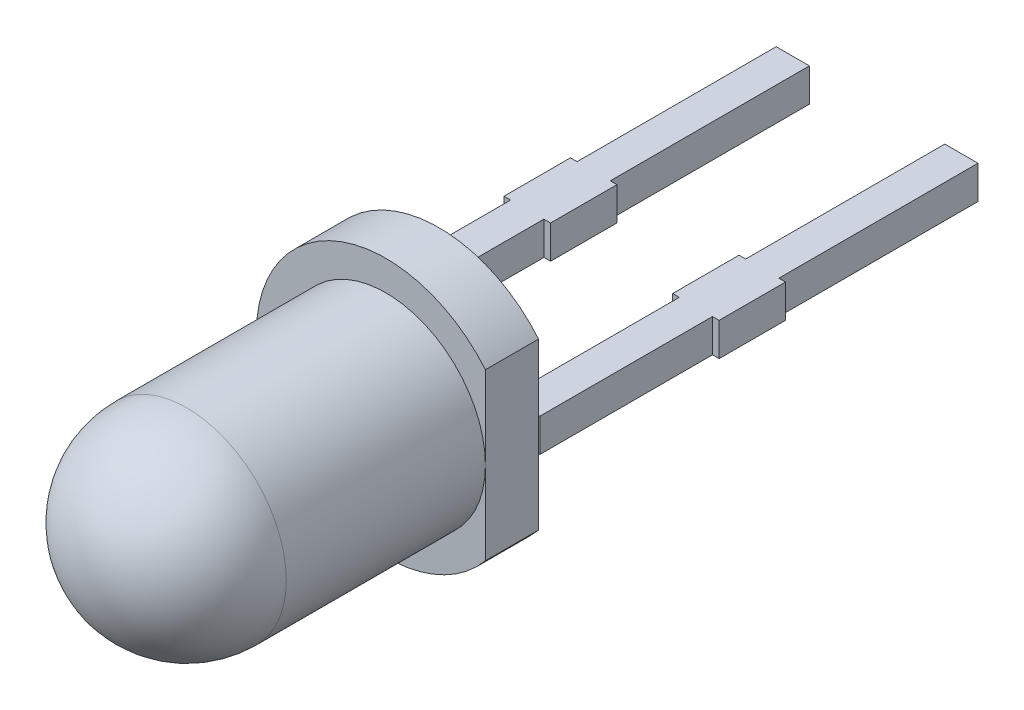
ISO-10303-21;
HEADER;
FILE_DESCRIPTION(('STEP AP214'),'2;1');
FILE_NAME('part.step','',(''),(''),'','','');
FILE_SCHEMA(('AUTOMOTIVE_DESIGN { 1 0 10303 214 1 1 1 1 }'));
ENDSEC;
DATA;
#1=APPLICATION_CONTEXT('core data for automotive mechanical design processes');
#2=APPLICATION_PROTOCOL_DEFINITION('international standard','automotive_design',2000,#1);
#3=PRODUCT_CONTEXT('',#1,'mechanical');
#4=PRODUCT('Part','Part','',(#3));
#5=PRODUCT_RELATED_PRODUCT_CATEGORY('part','',(#4));
#6=PRODUCT_DEFINITION_FORMATION('','',#4);
#7=PRODUCT_DEFINITION_CONTEXT('part definition',#1,'design');
#8=PRODUCT_DEFINITION('design','',#6,#7);
#9=PRODUCT_DEFINITION_SHAPE('','',#8);
#10=(LENGTH_UNIT() NAMED_UNIT(*) SI_UNIT(.MILLI.,.METRE.));
#11=(NAMED_UNIT(*) PLANE_ANGLE_UNIT() SI_UNIT($,.RADIAN.));
#12=(NAMED_UNIT(*) SI_UNIT($,.STERADIAN.) SOLID_ANGLE_UNIT());
#13=UNCERTAINTY_MEASURE_WITH_UNIT(LENGTH_MEASURE(1.E-05),#10,'distance_accuracy_value','');
#14=(GEOMETRIC_REPRESENTATION_CONTEXT(3) GLOBAL_UNCERTAINTY_ASSIGNED_CONTEXT((#13)) GLOBAL_UNIT_ASSIGNED_CONTEXT((#10,
#11,#12)) REPRESENTATION_CONTEXT('',''));
#15=CARTESIAN_POINT('',(0.,0.,0.));
#16=DIRECTION('',(0.,0.,1.));
#17=DIRECTION('',(1.,0.,0.));
#18=AXIS2_PLACEMENT_3D('',#15,#16,#17);
#19=CARTESIAN_POINT('',(-1.52,-0.25,3.6));
#20=DIRECTION('',(1.,0.,0.));
#21=DIRECTION('',(0.,0.,-1.));
#22=AXIS2_PLACEMENT_3D('',#19,#20,#21);
#23=PLANE('',#22);
#24=DIRECTION('',(0.,0.,-1.));
#25=VECTOR('',#24,1.);
#26=CARTESIAN_POINT('',(-1.52,0.25,3.6));
#27=LINE('',#26,#25);
#28=CARTESIAN_POINT('',(-1.52,0.25,3.6));
#29=VERTEX_POINT('',#28);
#30=CARTESIAN_POINT('',(-1.52,0.25,0.999999999999999));
#31=VERTEX_POINT('',#30);
#32=EDGE_CURVE('E162',#29,#31,#27,.T.);
#33=ORIENTED_EDGE('',*,*,#32,.T.);
#34=DIRECTION('',(0.,1.,0.));
#35=VECTOR('',#34,1.);
#36=CARTESIAN_POINT('',(-1.52,-0.25,0.999999999999999));
#37=LINE('',#36,#35);
#38=CARTESIAN_POINT('',(-1.52,-0.25,0.999999999999999));
#39=VERTEX_POINT('',#38);
#40=EDGE_CURVE('E41',#39,#31,#37,.T.);
#41=ORIENTED_EDGE('',*,*,#40,.F.);
#42=DIRECTION('',(0.,0.,-1.));
#43=VECTOR('',#42,1.);
#44=CARTESIAN_POINT('',(-1.52,-0.25,3.6));
#45=LINE('',#44,#43);
#46=CARTESIAN_POINT('',(-1.52,-0.25,3.6));
#47=VERTEX_POINT('',#46);
#48=EDGE_CURVE('E108',#47,#39,#45,.T.);
#49=ORIENTED_EDGE('',*,*,#48,.F.);
#50=DIRECTION('',(0.,1.,0.));
#51=VECTOR('',#50,1.);
#52=CARTESIAN_POINT('',(-1.52,-0.25,3.6));
#53=LINE('',#52,#51);
#54=EDGE_CURVE('E11',#47,#29,#53,.T.);
#55=ORIENTED_EDGE('',*,*,#54,.T.);
#56=EDGE_LOOP('',(#33,#41,#49,#55));
#57=FACE_BOUND('',#56,.T.);
#58=ADVANCED_FACE('F34',(#57),#23,.F.);
#59=CARTESIAN_POINT('',(-1.52,-0.25,0.999999999999999));
#60=DIRECTION('',(0.,0.,-1.));
#61=DIRECTION('',(-1.,0.,0.));
#62=AXIS2_PLACEMENT_3D('',#59,#60,#61);
#63=PLANE('',#62);
#64=DIRECTION('',(-1.,0.,0.));
#65=VECTOR('',#64,1.);
#66=CARTESIAN_POINT('',(-1.52,0.25,0.999999999999999));
#67=LINE('',#66,#65);
#68=CARTESIAN_POINT('',(-1.62,0.25,0.999999999999999));
#69=VERTEX_POINT('',#68);
#70=EDGE_CURVE('E165',#31,#69,#67,.T.);
#71=ORIENTED_EDGE('',*,*,#70,.T.);
#72=DIRECTION('',(0.,1.,0.));
#73=VECTOR('',#72,1.);
#74=CARTESIAN_POINT('',(-1.62,-0.25,0.999999999999999));
#75=LINE('',#74,#73);
#76=CARTESIAN_POINT('',(-1.62,-0.25,0.999999999999999));
#77=VERTEX_POINT('',#76);
#78=EDGE_CURVE('E204',#77,#69,#75,.T.);
#79=ORIENTED_EDGE('',*,*,#78,.F.);
#80=DIRECTION('',(-1.,0.,0.));
#81=VECTOR('',#80,1.);
#82=CARTESIAN_POINT('',(-1.52,-0.25,0.999999999999999));
#83=LINE('',#82,#81);
#84=EDGE_CURVE('E212',#39,#77,#83,.T.);
#85=ORIENTED_EDGE('',*,*,#84,.F.);
#86=ORIENTED_EDGE('',*,*,#40,.T.);
#87=EDGE_LOOP('',(#71,#79,#85,#86));
#88=FACE_BOUND('',#87,.T.);
#89=ADVANCED_FACE('F210',(#88),#63,.F.);
#90=CARTESIAN_POINT('',(-1.62,-0.25,0.999999999999999));
#91=DIRECTION('',(1.,0.,0.));
#92=DIRECTION('',(0.,0.,-1.));
#93=AXIS2_PLACEMENT_3D('',#90,#91,#92);
#94=PLANE('',#93);
#95=DIRECTION('',(0.,0.,-1.));
#96=VECTOR('',#95,1.);
#97=CARTESIAN_POINT('',(-1.62,0.25,0.999999999999999));
#98=LINE('',#97,#96);
#99=CARTESIAN_POINT('',(-1.62,0.25,0.));
#100=VERTEX_POINT('',#99);
#101=EDGE_CURVE('E167',#69,#100,#98,.T.);
#102=ORIENTED_EDGE('',*,*,#101,.T.);
#103=DIRECTION('',(0.,1.,0.));
#104=VECTOR('',#103,1.);
#105=CARTESIAN_POINT('',(-1.62,-0.25,0.));
#106=LINE('',#105,#104);
#107=CARTESIAN_POINT('',(-1.62,-0.25,0.));
#108=VERTEX_POINT('',#107);
#109=EDGE_CURVE('E201',#108,#100,#106,.T.);
#110=ORIENTED_EDGE('',*,*,#109,.F.);
#111=DIRECTION('',(0.,0.,-1.));
#112=VECTOR('',#111,1.);
#113=CARTESIAN_POINT('',(-1.62,-0.25,0.999999999999999));
#114=LINE('',#113,#112);
#115=EDGE_CURVE('E230',#77,#108,#114,.T.);
#116=ORIENTED_EDGE('',*,*,#115,.F.);
#117=ORIENTED_EDGE('',*,*,#78,.T.);
#118=EDGE_LOOP('',(#102,#110,#116,#117));
#119=FACE_BOUND('',#118,.T.);
#120=ADVANCED_FACE('F221',(#119),#94,.F.);
#121=CARTESIAN_POINT('',(-1.62,-0.25,0.));
#122=DIRECTION('',(0.,0.,1.));
#123=DIRECTION('',(1.,0.,0.));
#124=AXIS2_PLACEMENT_3D('',#121,#122,#123);
#125=PLANE('',#124);
#126=DIRECTION('',(1.,0.,0.));
#127=VECTOR('',#126,1.);
#128=CARTESIAN_POINT('',(-1.62,0.25,0.));
#129=LINE('',#128,#127);
#130=CARTESIAN_POINT('',(-1.52,0.25,0.));
#131=VERTEX_POINT('',#130);
#132=EDGE_CURVE('E169',#100,#131,#129,.T.);
#133=ORIENTED_EDGE('',*,*,#132,.T.);
#134=DIRECTION('',(0.,1.,0.));
#135=VECTOR('',#134,1.);
#136=CARTESIAN_POINT('',(-1.52,-0.25,0.));
#137=LINE('',#136,#135);
#138=CARTESIAN_POINT('',(-1.52,-0.25,0.));
#139=VERTEX_POINT('',#138);
#140=EDGE_CURVE('E198',#139,#131,#137,.T.);
#141=ORIENTED_EDGE('',*,*,#140,.F.);
#142=DIRECTION('',(1.,0.,0.));
#143=VECTOR('',#142,1.);
#144=CARTESIAN_POINT('',(-1.62,-0.25,0.));
#145=LINE('',#144,#143);
#146=EDGE_CURVE('E227',#108,#139,#145,.T.);
#147=ORIENTED_EDGE('',*,*,#146,.F.);
#148=ORIENTED_EDGE('',*,*,#109,.T.);
#149=EDGE_LOOP('',(#133,#141,#147,#148));
#150=FACE_BOUND('',#149,.T.);
#151=ADVANCED_FACE('F225',(#150),#125,.F.);
#152=CARTESIAN_POINT('',(-1.52,-0.25,0.));
#153=DIRECTION('',(1.,0.,0.));
#154=DIRECTION('',(0.,0.,-1.));
#155=AXIS2_PLACEMENT_3D('',#152,#153,#154);
#156=PLANE('',#155);
#157=DIRECTION('',(0.,0.,-1.));
#158=VECTOR('',#157,1.);
#159=CARTESIAN_POINT('',(-1.52,0.25,0.));
#160=LINE('',#159,#158);
#161=CARTESIAN_POINT('',(-1.52,0.25,-3.));
#162=VERTEX_POINT('',#161);
#163=EDGE_CURVE('E171',#131,#162,#160,.T.);
#164=ORIENTED_EDGE('',*,*,#163,.T.);
#165=DIRECTION('',(0.,1.,0.));
#166=VECTOR('',#165,1.);
#167=CARTESIAN_POINT('',(-1.52,-0.25,-3.));
#168=LINE('',#167,#166);
#169=CARTESIAN_POINT('',(-1.52,-0.25,-3.));
#170=VERTEX_POINT('',#169);
#171=EDGE_CURVE('E195',#170,#162,#168,.T.);
#172=ORIENTED_EDGE('',*,*,#171,.F.);
#173=DIRECTION('',(0.,0.,-1.));
#174=VECTOR('',#173,1.);
#175=CARTESIAN_POINT('',(-1.52,-0.25,0.));
#176=LINE('',#175,#174);
#177=EDGE_CURVE('E229',#139,#170,#176,.T.);
#178=ORIENTED_EDGE('',*,*,#177,.F.);
#179=ORIENTED_EDGE('',*,*,#140,.T.);
#180=EDGE_LOOP('',(#164,#172,#178,#179));
#181=FACE_BOUND('',#180,.T.);
#182=ADVANCED_FACE('F554',(#181),#156,.F.);
#183=CARTESIAN_POINT('',(-1.52,-0.25,-3.));
#184=DIRECTION('',(0.,0.,1.));
#185=DIRECTION('',(1.,0.,0.));
#186=AXIS2_PLACEMENT_3D('',#183,#184,#185);
#187=PLANE('',#186);
#188=DIRECTION('',(1.,0.,0.));
#189=VECTOR('',#188,1.);
#190=CARTESIAN_POINT('',(-1.52,0.25,-3.));
#191=LINE('',#190,#189);
#192=CARTESIAN_POINT('',(-1.02,0.25,-3.));
#193=VERTEX_POINT('',#192);
#194=EDGE_CURVE('E173',#162,#193,#191,.T.);
#195=ORIENTED_EDGE('',*,*,#194,.T.);
#196=DIRECTION('',(0.,1.,0.));
#197=VECTOR('',#196,1.);
#198=CARTESIAN_POINT('',(-1.02,-0.25,-3.));
#199=LINE('',#198,#197);
#200=CARTESIAN_POINT('',(-1.02,-0.25,-3.));
#201=VERTEX_POINT('',#200);
#202=EDGE_CURVE('E192',#201,#193,#199,.T.);
#203=ORIENTED_EDGE('',*,*,#202,.F.);
#204=DIRECTION('',(1.,0.,0.));
#205=VECTOR('',#204,1.);
#206=CARTESIAN_POINT('',(-1.52,-0.25,-3.));
#207=LINE('',#206,#205);
#208=EDGE_CURVE('E232',#170,#201,#207,.T.);
#209=ORIENTED_EDGE('',*,*,#208,.F.);
#210=ORIENTED_EDGE('',*,*,#171,.T.);
#211=EDGE_LOOP('',(#195,#203,#209,#210));
#212=FACE_BOUND('',#211,.T.);
#213=ADVANCED_FACE('F557',(#212),#187,.F.);
#214=CARTESIAN_POINT('',(-1.02,-0.25,0.));
#215=DIRECTION('',(-1.,0.,0.));
#216=DIRECTION('',(0.,0.,1.));
#217=AXIS2_PLACEMENT_3D('',#214,#215,#216);
#218=PLANE('',#217);
#219=DIRECTION('',(0.,0.,1.));
#220=VECTOR('',#219,1.);
#221=CARTESIAN_POINT('',(-1.02,0.25,0.));
#222=LINE('',#221,#220);
#223=CARTESIAN_POINT('',(-1.02,0.25,0.));
#224=VERTEX_POINT('',#223);
#225=EDGE_CURVE('E175',#193,#224,#222,.T.);
#226=ORIENTED_EDGE('',*,*,#225,.T.);
#227=DIRECTION('',(0.,1.,0.));
#228=VECTOR('',#227,1.);
#229=CARTESIAN_POINT('',(-1.02,-0.25,0.));
#230=LINE('',#229,#228);
#231=CARTESIAN_POINT('',(-1.02,-0.25,0.));
#232=VERTEX_POINT('',#231);
#233=EDGE_CURVE('E189',#232,#224,#230,.T.);
#234=ORIENTED_EDGE('',*,*,#233,.F.);
#235=DIRECTION('',(0.,0.,1.));
#236=VECTOR('',#235,1.);
#237=CARTESIAN_POINT('',(-1.02,-0.25,0.));
#238=LINE('',#237,#236);
#239=EDGE_CURVE('E238',#201,#232,#238,.T.);
#240=ORIENTED_EDGE('',*,*,#239,.F.);
#241=ORIENTED_EDGE('',*,*,#202,.T.);
#242=EDGE_LOOP('',(#226,#234,#240,#241));
#243=FACE_BOUND('',#242,.T.);
#244=ADVANCED_FACE('F244',(#243),#218,.F.);
#245=CARTESIAN_POINT('',(-0.92,-0.25,0.));
#246=DIRECTION('',(0.,0.,1.));
#247=DIRECTION('',(1.,0.,0.));
#248=AXIS2_PLACEMENT_3D('',#245,#246,#247);
#249=PLANE('',#248);
#250=DIRECTION('',(1.,0.,0.));
#251=VECTOR('',#250,1.);
#252=CARTESIAN_POINT('',(-0.92,0.25,0.));
#253=LINE('',#252,#251);
#254=CARTESIAN_POINT('',(-0.92,0.25,0.));
#255=VERTEX_POINT('',#254);
#256=EDGE_CURVE('E177',#224,#255,#253,.T.);
#257=ORIENTED_EDGE('',*,*,#256,.T.);
#258=DIRECTION('',(0.,1.,0.));
#259=VECTOR('',#258,1.);
#260=CARTESIAN_POINT('',(-0.92,-0.25,0.));
#261=LINE('',#260,#259);
#262=CARTESIAN_POINT('',(-0.92,-0.25,0.));
#263=VERTEX_POINT('',#262);
#264=EDGE_CURVE('E150',#263,#255,#261,.T.);
#265=ORIENTED_EDGE('',*,*,#264,.F.);
#266=DIRECTION('',(1.,0.,0.));
#267=VECTOR('',#266,1.);
#268=CARTESIAN_POINT('',(-0.92,-0.25,0.));
#269=LINE('',#268,#267);
#270=EDGE_CURVE('E141',#232,#263,#269,.T.);
#271=ORIENTED_EDGE('',*,*,#270,.F.);
#272=ORIENTED_EDGE('',*,*,#233,.T.);
#273=EDGE_LOOP('',(#257,#265,#271,#272));
#274=FACE_BOUND('',#273,.T.);
#275=ADVANCED_FACE('F248',(#274),#249,.F.);
#276=CARTESIAN_POINT('',(-0.919999999999999,-0.25,0.999999999999999));
#277=DIRECTION('',(-1.,0.,0.));
#278=DIRECTION('',(0.,0.,1.));
#279=AXIS2_PLACEMENT_3D('',#276,#277,#278);
#280=PLANE('',#279);
#281=DIRECTION('',(0.,0.,1.));
#282=VECTOR('',#281,1.);
#283=CARTESIAN_POINT('',(-0.919999999999999,0.25,0.999999999999999));
#284=LINE('',#283,#282);
#285=CARTESIAN_POINT('',(-0.919999999999999,0.25,0.999999999999999));
#286=VERTEX_POINT('',#285);
#287=EDGE_CURVE('E149',#255,#286,#284,.T.);
#288=ORIENTED_EDGE('',*,*,#287,.T.);
#289=DIRECTION('',(0.,1.,0.));
#290=VECTOR('',#289,1.);
#291=CARTESIAN_POINT('',(-0.919999999999999,-0.25,0.999999999999999));
#292=LINE('',#291,#290);
#293=CARTESIAN_POINT('',(-0.919999999999999,-0.25,0.999999999999999));
#294=VERTEX_POINT('',#293);
#295=EDGE_CURVE('E146',#294,#286,#292,.T.);
#296=ORIENTED_EDGE('',*,*,#295,.F.);
#297=DIRECTION('',(0.,0.,1.));
#298=VECTOR('',#297,1.);
#299=CARTESIAN_POINT('',(-0.919999999999999,-0.25,0.999999999999999));
#300=LINE('',#299,#298);
#301=EDGE_CURVE('E135',#263,#294,#300,.T.);
#302=ORIENTED_EDGE('',*,*,#301,.F.);
#303=ORIENTED_EDGE('',*,*,#264,.T.);
#304=EDGE_LOOP('',(#288,#296,#302,#303));
#305=FACE_BOUND('',#304,.T.);
#306=ADVANCED_FACE('F147',(#305),#280,.F.);
#307=CARTESIAN_POINT('',(-1.02,-0.25,0.999999999999999));
#308=DIRECTION('',(0.,0.,-1.));
#309=DIRECTION('',(-1.,0.,0.));
#310=AXIS2_PLACEMENT_3D('',#307,#308,#309);
#311=PLANE('',#310);
#312=DIRECTION('',(-1.,0.,0.));
#313=VECTOR('',#312,1.);
#314=CARTESIAN_POINT('',(-1.02,0.25,0.999999999999999));
#315=LINE('',#314,#313);
#316=CARTESIAN_POINT('',(-1.02,0.25,0.999999999999999));
#317=VERTEX_POINT('',#316);
#318=EDGE_CURVE('E100',#286,#317,#315,.T.);
#319=ORIENTED_EDGE('',*,*,#318,.T.);
#320=DIRECTION('',(0.,1.,0.));
#321=VECTOR('',#320,1.);
#322=CARTESIAN_POINT('',(-1.02,-0.25,0.999999999999999));
#323=LINE('',#322,#321);
#324=CARTESIAN_POINT('',(-1.02,-0.25,0.999999999999999));
#325=VERTEX_POINT('',#324);
#326=EDGE_CURVE('E151',#325,#317,#323,.T.);
#327=ORIENTED_EDGE('',*,*,#326,.F.);
#328=DIRECTION('',(-1.,0.,0.));
#329=VECTOR('',#328,1.);
#330=CARTESIAN_POINT('',(-1.02,-0.25,0.999999999999999));
#331=LINE('',#330,#329);
#332=EDGE_CURVE('E139',#294,#325,#331,.T.);
#333=ORIENTED_EDGE('',*,*,#332,.F.);
#334=ORIENTED_EDGE('',*,*,#295,.T.);
#335=EDGE_LOOP('',(#319,#327,#333,#334));
#336=FACE_BOUND('',#335,.T.);
#337=ADVANCED_FACE('F153',(#336),#311,.F.);
#338=CARTESIAN_POINT('',(-1.02,-0.25,3.6));
#339=DIRECTION('',(-1.,0.,0.));
#340=DIRECTION('',(0.,0.,1.));
#341=AXIS2_PLACEMENT_3D('',#338,#339,#340);
#342=PLANE('',#341);
#343=DIRECTION('',(0.,0.,1.));
#344=VECTOR('',#343,1.);
#345=CARTESIAN_POINT('',(-1.02,0.25,3.6));
#346=LINE('',#345,#344);
#347=CARTESIAN_POINT('',(-1.02,0.25,3.6));
#348=VERTEX_POINT('',#347);
#349=EDGE_CURVE('E181',#317,#348,#346,.T.);
#350=ORIENTED_EDGE('',*,*,#349,.T.);
#351=DIRECTION('',(0.,1.,0.));
#352=VECTOR('',#351,1.);
#353=CARTESIAN_POINT('',(-1.02,-0.25,3.6));
#354=LINE('',#353,#352);
#355=CARTESIAN_POINT('',(-1.02,-0.25,3.6));
#356=VERTEX_POINT('',#355);
#357=EDGE_CURVE('E155',#356,#348,#354,.T.);
#358=ORIENTED_EDGE('',*,*,#357,.F.);
#359=DIRECTION('',(0.,0.,1.));
#360=VECTOR('',#359,1.);
#361=CARTESIAN_POINT('',(-1.02,-0.25,3.6));
#362=LINE('',#361,#360);
#363=EDGE_CURVE('E57',#325,#356,#362,.T.);
#364=ORIENTED_EDGE('',*,*,#363,.F.);
#365=ORIENTED_EDGE('',*,*,#326,.T.);
#366=EDGE_LOOP('',(#350,#358,#364,#365));
#367=FACE_BOUND('',#366,.T.);
#368=ADVANCED_FACE('F251',(#367),#342,.F.);
#369=CARTESIAN_POINT('',(0.,-0.25,0.));
#370=DIRECTION('',(0.,1.,0.));
#371=DIRECTION('',(0.,0.,1.));
#372=AXIS2_PLACEMENT_3D('',#369,#370,#371);
#373=PLANE('',#372);
#374=DIRECTION('',(-1.,0.,0.));
#375=VECTOR('',#374,1.);
#376=CARTESIAN_POINT('',(-1.52,-0.25,3.6));
#377=LINE('',#376,#375);
#378=EDGE_CURVE('E184',#356,#47,#377,.T.);
#379=ORIENTED_EDGE('',*,*,#378,.T.);
#380=ORIENTED_EDGE('',*,*,#48,.T.);
#381=ORIENTED_EDGE('',*,*,#84,.T.);
#382=ORIENTED_EDGE('',*,*,#115,.T.);
#383=ORIENTED_EDGE('',*,*,#146,.T.);
#384=ORIENTED_EDGE('',*,*,#177,.T.);
#385=ORIENTED_EDGE('',*,*,#208,.T.);
#386=ORIENTED_EDGE('',*,*,#239,.T.);
#387=ORIENTED_EDGE('',*,*,#270,.T.);
#388=ORIENTED_EDGE('',*,*,#301,.T.);
#389=ORIENTED_EDGE('',*,*,#332,.T.);
#390=ORIENTED_EDGE('',*,*,#363,.T.);
#391=EDGE_LOOP('',(#379,#380,#381,#382,#383,#384,#385,#386,#387,#388,#389,#390));
#392=FACE_BOUND('',#391,.T.);
#393=ADVANCED_FACE('F137',(#392),#373,.F.);
#394=CARTESIAN_POINT('',(0.,0.25,0.));
#395=DIRECTION('',(0.,1.,0.));
#396=DIRECTION('',(0.,0.,1.));
#397=AXIS2_PLACEMENT_3D('',#394,#395,#396);
#398=PLANE('',#397);
#399=DIRECTION('',(-1.,0.,0.));
#400=VECTOR('',#399,1.);
#401=CARTESIAN_POINT('',(-1.52,0.25,3.6));
#402=LINE('',#401,#400);
#403=EDGE_CURVE('E159',#348,#29,#402,.T.);
#404=ORIENTED_EDGE('',*,*,#403,.F.);
#405=ORIENTED_EDGE('',*,*,#349,.F.);
#406=ORIENTED_EDGE('',*,*,#318,.F.);
#407=ORIENTED_EDGE('',*,*,#287,.F.);
#408=ORIENTED_EDGE('',*,*,#256,.F.);
#409=ORIENTED_EDGE('',*,*,#225,.F.);
#410=ORIENTED_EDGE('',*,*,#194,.F.);
#411=ORIENTED_EDGE('',*,*,#163,.F.);
#412=ORIENTED_EDGE('',*,*,#132,.F.);
#413=ORIENTED_EDGE('',*,*,#101,.F.);
#414=ORIENTED_EDGE('',*,*,#70,.F.);
#415=ORIENTED_EDGE('',*,*,#32,.F.);
#416=EDGE_LOOP('',(#404,#405,#406,#407,#408,#409,#410,#411,#412,#413,#414,#415));
#417=FACE_BOUND('',#416,.T.);
#418=ADVANCED_FACE('F216',(#417),#398,.T.);
#419=CARTESIAN_POINT('',(1.95,0.,3.6));
#420=DIRECTION('',(0.,0.,-1.));
#421=DIRECTION('',(-1.,0.,0.));
#422=AXIS2_PLACEMENT_3D('',#419,#420,#421);
#423=PLANE('',#422);
#424=DIRECTION('',(0.,-1.,0.));
#425=VECTOR('',#424,1.);
#426=CARTESIAN_POINT('',(1.5,1.24599357943771,3.6));
#427=LINE('',#426,#425);
#428=CARTESIAN_POINT('',(1.5,-0.25,3.6));
#429=VERTEX_POINT('',#428);
#430=CARTESIAN_POINT('',(1.5,-1.24599357943771,3.6));
#431=VERTEX_POINT('',#430);
#432=EDGE_CURVE('E389',#429,#431,#427,.T.);
#433=ORIENTED_EDGE('',*,*,#432,.T.);
#434=CARTESIAN_POINT('',(0.,0.,3.6));
#435=DIRECTION('',(0.,0.,1.));
#436=DIRECTION('',(1.,0.,0.));
#437=AXIS2_PLACEMENT_3D('',#434,#435,#436);
#438=CIRCLE('',#437,1.95);
#439=CARTESIAN_POINT('',(1.5,1.24599357943771,3.6));
#440=VERTEX_POINT('',#439);
#441=EDGE_CURVE('E163',#440,#431,#438,.T.);
#442=ORIENTED_EDGE('',*,*,#441,.F.);
#443=CARTESIAN_POINT('',(1.5,0.25,3.6));
#444=VERTEX_POINT('',#443);
#445=EDGE_CURVE('E386',#440,#444,#427,.T.);
#446=ORIENTED_EDGE('',*,*,#445,.T.);
#447=DIRECTION('',(-1.,0.,0.));
#448=VECTOR('',#447,1.);
#449=CARTESIAN_POINT('',(1.02,0.25,3.6));
#450=LINE('',#449,#448);
#451=CARTESIAN_POINT('',(1.02,0.25,3.6));
#452=VERTEX_POINT('',#451);
#453=EDGE_CURVE('E48',#444,#452,#450,.T.);
#454=ORIENTED_EDGE('',*,*,#453,.T.);
#455=DIRECTION('',(0.,1.,0.));
#456=VECTOR('',#455,1.);
#457=CARTESIAN_POINT('',(1.02,-0.25,3.6));
#458=LINE('',#457,#456);
#459=CARTESIAN_POINT('',(1.02,-0.25,3.6));
#460=VERTEX_POINT('',#459);
#461=EDGE_CURVE('E274',#460,#452,#458,.T.);
#462=ORIENTED_EDGE('',*,*,#461,.F.);
#463=DIRECTION('',(-1.,0.,0.));
#464=VECTOR('',#463,1.);
#465=CARTESIAN_POINT('',(1.02,-0.25,3.6));
#466=LINE('',#465,#464);
#467=EDGE_CURVE('E378',#429,#460,#466,.T.);
#468=ORIENTED_EDGE('',*,*,#467,.F.);
#469=EDGE_LOOP('',(#433,#442,#446,#454,#462,#468));
#470=FACE_BOUND('',#469,.T.);
#471=ORIENTED_EDGE('',*,*,#357,.T.);
#472=ORIENTED_EDGE('',*,*,#403,.T.);
#473=ORIENTED_EDGE('',*,*,#54,.F.);
#474=ORIENTED_EDGE('',*,*,#378,.F.);
#475=EDGE_LOOP('',(#471,#472,#473,#474));
#476=FACE_BOUND('',#475,.T.);
#477=ADVANCED_FACE('F255',(#470,#476),#423,.T.);
#478=CARTESIAN_POINT('',(0.,0.,3.6));
#479=DIRECTION('',(0.,0.,1.));
#480=DIRECTION('',(1.,0.,0.));
#481=AXIS2_PLACEMENT_3D('',#478,#479,#480);
#482=CYLINDRICAL_SURFACE('',#481,1.95);
#483=DIRECTION('',(0.,0.,1.));
#484=VECTOR('',#483,1.);
#485=CARTESIAN_POINT('',(1.5,-1.24599357943771,1.06770854757988));
#486=LINE('',#485,#484);
#487=CARTESIAN_POINT('',(1.5,-1.24599357943771,4.4));
#488=VERTEX_POINT('',#487);
#489=EDGE_CURVE('E383',#431,#488,#486,.T.);
#490=ORIENTED_EDGE('',*,*,#489,.T.);
#491=CARTESIAN_POINT('',(0.,0.,4.4));
#492=DIRECTION('',(0.,0.,1.));
#493=DIRECTION('',(1.,0.,0.));
#494=AXIS2_PLACEMENT_3D('',#491,#492,#493);
#495=CIRCLE('',#494,1.95);
#496=CARTESIAN_POINT('',(1.5,1.24599357943771,4.4));
#497=VERTEX_POINT('',#496);
#498=EDGE_CURVE('E262',#497,#488,#495,.T.);
#499=ORIENTED_EDGE('',*,*,#498,.F.);
#500=DIRECTION('',(0.,0.,1.));
#501=VECTOR('',#500,1.);
#502=CARTESIAN_POINT('',(1.5,1.24599357943771,1.06770854757988));
#503=LINE('',#502,#501);
#504=EDGE_CURVE('E345',#440,#497,#503,.T.);
#505=ORIENTED_EDGE('',*,*,#504,.F.);
#506=ORIENTED_EDGE('',*,*,#441,.T.);
#507=EDGE_LOOP('',(#490,#499,#505,#506));
#508=FACE_BOUND('',#507,.T.);
#509=ADVANCED_FACE('F411',(#508),#482,.T.);
#510=CARTESIAN_POINT('',(1.5,0.,4.4));
#511=DIRECTION('',(0.,0.,1.));
#512=DIRECTION('',(1.,0.,0.));
#513=AXIS2_PLACEMENT_3D('',#510,#511,#512);
#514=PLANE('',#513);
#515=DIRECTION('',(0.,-1.,0.));
#516=VECTOR('',#515,1.);
#517=CARTESIAN_POINT('',(1.5,1.24599357943771,4.4));
#518=LINE('',#517,#516);
#519=CARTESIAN_POINT('',(1.5,0.,4.4));
#520=VERTEX_POINT('',#519);
#521=EDGE_CURVE('E390',#497,#520,#518,.T.);
#522=ORIENTED_EDGE('',*,*,#521,.F.);
#523=ORIENTED_EDGE('',*,*,#498,.T.);
#524=EDGE_CURVE('E392',#520,#488,#518,.T.);
#525=ORIENTED_EDGE('',*,*,#524,.F.);
#526=CARTESIAN_POINT('',(0.,0.,4.4));
#527=DIRECTION('',(0.,0.,1.));
#528=DIRECTION('',(1.,0.,0.));
#529=AXIS2_PLACEMENT_3D('',#526,#527,#528);
#530=CIRCLE('',#529,1.5);
#531=EDGE_CURVE('E265',#520,#520,#530,.T.);
#532=ORIENTED_EDGE('',*,*,#531,.F.);
#533=EDGE_LOOP('',(#522,#523,#525,#532));
#534=FACE_BOUND('',#533,.T.);
#535=ADVANCED_FACE('F414',(#534),#514,.T.);
#536=CARTESIAN_POINT('',(0.,0.,3.6));
#537=DIRECTION('',(0.,0.,1.));
#538=DIRECTION('',(1.,0.,0.));
#539=AXIS2_PLACEMENT_3D('',#536,#537,#538);
#540=CYLINDRICAL_SURFACE('',#539,1.5);
#541=ORIENTED_EDGE('',*,*,#531,.T.);
#542=EDGE_LOOP('',(#541));
#543=FACE_BOUND('',#542,.T.);
#544=CARTESIAN_POINT('',(0.,0.,7.4));
#545=DIRECTION('',(0.,0.,1.));
#546=DIRECTION('',(1.,0.,0.));
#547=AXIS2_PLACEMENT_3D('',#544,#545,#546);
#548=CIRCLE('',#547,1.5);
#549=CARTESIAN_POINT('',(1.5,0.,7.4));
#550=VERTEX_POINT('',#549);
#551=EDGE_CURVE('E268',#550,#550,#548,.T.);
#552=ORIENTED_EDGE('',*,*,#551,.F.);
#553=EDGE_LOOP('',(#552));
#554=FACE_BOUND('',#553,.T.);
#555=ADVANCED_FACE('F582',(#543,#554),#540,.T.);
#556=CARTESIAN_POINT('',(0.,0.,7.4));
#557=DIRECTION('',(0.,0.,1.));
#558=DIRECTION('',(1.,0.,0.));
#559=AXIS2_PLACEMENT_3D('',#556,#557,#558);
#560=SPHERICAL_SURFACE('',#559,1.5);
#561=ORIENTED_EDGE('',*,*,#551,.T.);
#562=EDGE_LOOP('',(#561));
#563=FACE_BOUND('',#562,.T.);
#564=ADVANCED_FACE('F541',(#563),#560,.T.);
#565=CARTESIAN_POINT('',(1.52,-0.25,3.6));
#566=DIRECTION('',(-1.,0.,0.));
#567=DIRECTION('',(0.,0.,1.));
#568=AXIS2_PLACEMENT_3D('',#565,#566,#567);
#569=PLANE('',#568);
#570=DIRECTION('',(0.,0.,1.));
#571=VECTOR('',#570,1.);
#572=CARTESIAN_POINT('',(1.52,0.25,3.6));
#573=LINE('',#572,#571);
#574=CARTESIAN_POINT('',(1.52,0.25,0.999999999999999));
#575=VERTEX_POINT('',#574);
#576=CARTESIAN_POINT('',(1.52,0.25,3.6));
#577=VERTEX_POINT('',#576);
#578=EDGE_CURVE('E342',#575,#577,#573,.T.);
#579=ORIENTED_EDGE('',*,*,#578,.T.);
#580=DIRECTION('',(0.,1.,0.));
#581=VECTOR('',#580,1.);
#582=CARTESIAN_POINT('',(1.52,-0.25,3.6));
#583=LINE('',#582,#581);
#584=CARTESIAN_POINT('',(1.52,-0.25,3.6));
#585=VERTEX_POINT('',#584);
#586=EDGE_CURVE('E271',#585,#577,#583,.T.);
#587=ORIENTED_EDGE('',*,*,#586,.F.);
#588=DIRECTION('',(0.,0.,1.));
#589=VECTOR('',#588,1.);
#590=CARTESIAN_POINT('',(1.52,-0.25,3.6));
#591=LINE('',#590,#589);
#592=CARTESIAN_POINT('',(1.52,-0.25,0.999999999999999));
#593=VERTEX_POINT('',#592);
#594=EDGE_CURVE('E311',#593,#585,#591,.T.);
#595=ORIENTED_EDGE('',*,*,#594,.F.);
#596=DIRECTION('',(0.,1.,0.));
#597=VECTOR('',#596,1.);
#598=CARTESIAN_POINT('',(1.52,-0.25,0.999999999999999));
#599=LINE('',#598,#597);
#600=EDGE_CURVE('E304',#593,#575,#599,.T.);
#601=ORIENTED_EDGE('',*,*,#600,.T.);
#602=EDGE_LOOP('',(#579,#587,#595,#601));
#603=FACE_BOUND('',#602,.T.);
#604=ADVANCED_FACE('F481',(#603),#569,.F.);
#605=CARTESIAN_POINT('',(1.02,-0.25,3.6));
#606=DIRECTION('',(1.,0.,0.));
#607=DIRECTION('',(0.,0.,-1.));
#608=AXIS2_PLACEMENT_3D('',#605,#606,#607);
#609=PLANE('',#608);
#610=DIRECTION('',(0.,0.,-1.));
#611=VECTOR('',#610,1.);
#612=CARTESIAN_POINT('',(1.02,0.25,3.6));
#613=LINE('',#612,#611);
#614=CARTESIAN_POINT('',(1.02,0.25,0.999999999999999));
#615=VERTEX_POINT('',#614);
#616=EDGE_CURVE('E336',#452,#615,#613,.T.);
#617=ORIENTED_EDGE('',*,*,#616,.T.);
#618=DIRECTION('',(0.,1.,0.));
#619=VECTOR('',#618,1.);
#620=CARTESIAN_POINT('',(1.02,-0.25,0.999999999999999));
#621=LINE('',#620,#619);
#622=CARTESIAN_POINT('',(1.02,-0.25,0.999999999999999));
#623=VERTEX_POINT('',#622);
#624=EDGE_CURVE('E277',#623,#615,#621,.T.);
#625=ORIENTED_EDGE('',*,*,#624,.F.);
#626=DIRECTION('',(0.,0.,-1.));
#627=VECTOR('',#626,1.);
#628=CARTESIAN_POINT('',(1.02,-0.25,3.6));
#629=LINE('',#628,#627);
#630=EDGE_CURVE('E372',#460,#623,#629,.T.);
#631=ORIENTED_EDGE('',*,*,#630,.F.);
#632=ORIENTED_EDGE('',*,*,#461,.T.);
#633=EDGE_LOOP('',(#617,#625,#631,#632));
#634=FACE_BOUND('',#633,.T.);
#635=ADVANCED_FACE('F533',(#634),#609,.F.);
#636=CARTESIAN_POINT('',(1.02,-0.25,0.999999999999999));
#637=DIRECTION('',(0.,0.,-1.));
#638=DIRECTION('',(-1.,0.,0.));
#639=AXIS2_PLACEMENT_3D('',#636,#637,#638);
#640=PLANE('',#639);
#641=DIRECTION('',(-1.,0.,0.));
#642=VECTOR('',#641,1.);
#643=CARTESIAN_POINT('',(1.02,0.25,0.999999999999999));
#644=LINE('',#643,#642);
#645=CARTESIAN_POINT('',(0.919999999999999,0.25,0.999999999999999));
#646=VERTEX_POINT('',#645);
#647=EDGE_CURVE('E333',#615,#646,#644,.T.);
#648=ORIENTED_EDGE('',*,*,#647,.T.);
#649=DIRECTION('',(0.,1.,0.));
#650=VECTOR('',#649,1.);
#651=CARTESIAN_POINT('',(0.919999999999999,-0.25,0.999999999999999));
#652=LINE('',#651,#650);
#653=CARTESIAN_POINT('',(0.919999999999999,-0.25,0.999999999999999));
#654=VERTEX_POINT('',#653);
#655=EDGE_CURVE('E280',#654,#646,#652,.T.);
#656=ORIENTED_EDGE('',*,*,#655,.F.);
#657=DIRECTION('',(-1.,0.,0.));
#658=VECTOR('',#657,1.);
#659=CARTESIAN_POINT('',(1.02,-0.25,0.999999999999999));
#660=LINE('',#659,#658);
#661=EDGE_CURVE('E369',#623,#654,#660,.T.);
#662=ORIENTED_EDGE('',*,*,#661,.F.);
#663=ORIENTED_EDGE('',*,*,#624,.T.);
#664=EDGE_LOOP('',(#648,#656,#662,#663));
#665=FACE_BOUND('',#664,.T.);
#666=ADVANCED_FACE('F529',(#665),#640,.F.);
#667=CARTESIAN_POINT('',(0.919999999999999,-0.25,0.999999999999999));
#668=DIRECTION('',(1.,0.,0.));
#669=DIRECTION('',(0.,0.,-1.));
#670=AXIS2_PLACEMENT_3D('',#667,#668,#669);
#671=PLANE('',#670);
#672=DIRECTION('',(0.,0.,-1.));
#673=VECTOR('',#672,1.);
#674=CARTESIAN_POINT('',(0.919999999999999,0.25,0.999999999999999));
#675=LINE('',#674,#673);
#676=CARTESIAN_POINT('',(0.92,0.25,0.));
#677=VERTEX_POINT('',#676);
#678=EDGE_CURVE('E330',#646,#677,#675,.T.);
#679=ORIENTED_EDGE('',*,*,#678,.T.);
#680=DIRECTION('',(0.,1.,0.));
#681=VECTOR('',#680,1.);
#682=CARTESIAN_POINT('',(0.92,-0.25,0.));
#683=LINE('',#682,#681);
#684=CARTESIAN_POINT('',(0.92,-0.25,0.));
#685=VERTEX_POINT('',#684);
#686=EDGE_CURVE('E283',#685,#677,#683,.T.);
#687=ORIENTED_EDGE('',*,*,#686,.F.);
#688=DIRECTION('',(0.,0.,-1.));
#689=VECTOR('',#688,1.);
#690=CARTESIAN_POINT('',(0.919999999999999,-0.25,0.999999999999999));
#691=LINE('',#690,#689);
#692=EDGE_CURVE('E366',#654,#685,#691,.T.);
#693=ORIENTED_EDGE('',*,*,#692,.F.);
#694=ORIENTED_EDGE('',*,*,#655,.T.);
#695=EDGE_LOOP('',(#679,#687,#693,#694));
#696=FACE_BOUND('',#695,.T.);
#697=ADVANCED_FACE('F525',(#696),#671,.F.);
#698=CARTESIAN_POINT('',(0.92,-0.25,0.));
#699=DIRECTION('',(0.,0.,1.));
#700=DIRECTION('',(1.,0.,0.));
#701=AXIS2_PLACEMENT_3D('',#698,#699,#700);
#702=PLANE('',#701);
#703=DIRECTION('',(1.,0.,0.));
#704=VECTOR('',#703,1.);
#705=CARTESIAN_POINT('',(0.92,0.25,0.));
#706=LINE('',#705,#704);
#707=CARTESIAN_POINT('',(1.02,0.25,0.));
#708=VERTEX_POINT('',#707);
#709=EDGE_CURVE('E327',#677,#708,#706,.T.);
#710=ORIENTED_EDGE('',*,*,#709,.T.);
#711=DIRECTION('',(0.,1.,0.));
#712=VECTOR('',#711,1.);
#713=CARTESIAN_POINT('',(1.02,-0.25,0.));
#714=LINE('',#713,#712);
#715=CARTESIAN_POINT('',(1.02,-0.25,0.));
#716=VERTEX_POINT('',#715);
#717=EDGE_CURVE('E286',#716,#708,#714,.T.);
#718=ORIENTED_EDGE('',*,*,#717,.F.);
#719=DIRECTION('',(1.,0.,0.));
#720=VECTOR('',#719,1.);
#721=CARTESIAN_POINT('',(0.92,-0.25,0.));
#722=LINE('',#721,#720);
#723=EDGE_CURVE('E363',#685,#716,#722,.T.);
#724=ORIENTED_EDGE('',*,*,#723,.F.);
#725=ORIENTED_EDGE('',*,*,#686,.T.);
#726=EDGE_LOOP('',(#710,#718,#724,#725));
#727=FACE_BOUND('',#726,.T.);
#728=ADVANCED_FACE('F521',(#727),#702,.F.);
#729=CARTESIAN_POINT('',(1.02,-0.25,0.));
#730=DIRECTION('',(1.,0.,0.));
#731=DIRECTION('',(0.,0.,-1.));
#732=AXIS2_PLACEMENT_3D('',#729,#730,#731);
#733=PLANE('',#732);
#734=DIRECTION('',(0.,0.,-1.));
#735=VECTOR('',#734,1.);
#736=CARTESIAN_POINT('',(1.02,0.25,0.));
#737=LINE('',#736,#735);
#738=CARTESIAN_POINT('',(1.02,0.25,-3.));
#739=VERTEX_POINT('',#738);
#740=EDGE_CURVE('E324',#708,#739,#737,.T.);
#741=ORIENTED_EDGE('',*,*,#740,.T.);
#742=DIRECTION('',(0.,1.,0.));
#743=VECTOR('',#742,1.);
#744=CARTESIAN_POINT('',(1.02,-0.25,-3.));
#745=LINE('',#744,#743);
#746=CARTESIAN_POINT('',(1.02,-0.25,-3.));
#747=VERTEX_POINT('',#746);
#748=EDGE_CURVE('E289',#747,#739,#745,.T.);
#749=ORIENTED_EDGE('',*,*,#748,.F.);
#750=DIRECTION('',(0.,0.,-1.));
#751=VECTOR('',#750,1.);
#752=CARTESIAN_POINT('',(1.02,-0.25,0.));
#753=LINE('',#752,#751);
#754=EDGE_CURVE('E360',#716,#747,#753,.T.);
#755=ORIENTED_EDGE('',*,*,#754,.F.);
#756=ORIENTED_EDGE('',*,*,#717,.T.);
#757=EDGE_LOOP('',(#741,#749,#755,#756));
#758=FACE_BOUND('',#757,.T.);
#759=ADVANCED_FACE('F516',(#758),#733,.F.);
#760=CARTESIAN_POINT('',(1.52,-0.25,-3.));
#761=DIRECTION('',(0.,0.,1.));
#762=DIRECTION('',(1.,0.,0.));
#763=AXIS2_PLACEMENT_3D('',#760,#761,#762);
#764=PLANE('',#763);
#765=DIRECTION('',(1.,0.,0.));
#766=VECTOR('',#765,1.);
#767=CARTESIAN_POINT('',(1.52,0.25,-3.));
#768=LINE('',#767,#766);
#769=CARTESIAN_POINT('',(1.52,0.25,-3.));
#770=VERTEX_POINT('',#769);
#771=EDGE_CURVE('E321',#739,#770,#768,.T.);
#772=ORIENTED_EDGE('',*,*,#771,.T.);
#773=DIRECTION('',(0.,1.,0.));
#774=VECTOR('',#773,1.);
#775=CARTESIAN_POINT('',(1.52,-0.25,-3.));
#776=LINE('',#775,#774);
#777=CARTESIAN_POINT('',(1.52,-0.25,-3.));
#778=VERTEX_POINT('',#777);
#779=EDGE_CURVE('E292',#778,#770,#776,.T.);
#780=ORIENTED_EDGE('',*,*,#779,.F.);
#781=DIRECTION('',(1.,0.,0.));
#782=VECTOR('',#781,1.);
#783=CARTESIAN_POINT('',(1.52,-0.25,-3.));
#784=LINE('',#783,#782);
#785=EDGE_CURVE('E357',#747,#778,#784,.T.);
#786=ORIENTED_EDGE('',*,*,#785,.F.);
#787=ORIENTED_EDGE('',*,*,#748,.T.);
#788=EDGE_LOOP('',(#772,#780,#786,#787));
#789=FACE_BOUND('',#788,.T.);
#790=ADVANCED_FACE('F510',(#789),#764,.F.);
#791=CARTESIAN_POINT('',(1.52,-0.25,0.));
#792=DIRECTION('',(-1.,0.,0.));
#793=DIRECTION('',(0.,0.,1.));
#794=AXIS2_PLACEMENT_3D('',#791,#792,#793);
#795=PLANE('',#794);
#796=DIRECTION('',(0.,0.,1.));
#797=VECTOR('',#796,1.);
#798=CARTESIAN_POINT('',(1.52,0.25,0.));
#799=LINE('',#798,#797);
#800=CARTESIAN_POINT('',(1.52,0.25,0.));
#801=VERTEX_POINT('',#800);
#802=EDGE_CURVE('E318',#770,#801,#799,.T.);
#803=ORIENTED_EDGE('',*,*,#802,.T.);
#804=DIRECTION('',(0.,1.,0.));
#805=VECTOR('',#804,1.);
#806=CARTESIAN_POINT('',(1.52,-0.25,0.));
#807=LINE('',#806,#805);
#808=CARTESIAN_POINT('',(1.52,-0.25,0.));
#809=VERTEX_POINT('',#808);
#810=EDGE_CURVE('E295',#809,#801,#807,.T.);
#811=ORIENTED_EDGE('',*,*,#810,.F.);
#812=DIRECTION('',(0.,0.,1.));
#813=VECTOR('',#812,1.);
#814=CARTESIAN_POINT('',(1.52,-0.25,0.));
#815=LINE('',#814,#813);
#816=EDGE_CURVE('E354',#778,#809,#815,.T.);
#817=ORIENTED_EDGE('',*,*,#816,.F.);
#818=ORIENTED_EDGE('',*,*,#779,.T.);
#819=EDGE_LOOP('',(#803,#811,#817,#818));
#820=FACE_BOUND('',#819,.T.);
#821=ADVANCED_FACE('F506',(#820),#795,.F.);
#822=CARTESIAN_POINT('',(1.62,-0.25,0.));
#823=DIRECTION('',(0.,0.,1.));
#824=DIRECTION('',(1.,0.,0.));
#825=AXIS2_PLACEMENT_3D('',#822,#823,#824);
#826=PLANE('',#825);
#827=DIRECTION('',(1.,0.,0.));
#828=VECTOR('',#827,1.);
#829=CARTESIAN_POINT('',(1.62,0.25,0.));
#830=LINE('',#829,#828);
#831=CARTESIAN_POINT('',(1.62,0.25,0.));
#832=VERTEX_POINT('',#831);
#833=EDGE_CURVE('E315',#801,#832,#830,.T.);
#834=ORIENTED_EDGE('',*,*,#833,.T.);
#835=DIRECTION('',(0.,1.,0.));
#836=VECTOR('',#835,1.);
#837=CARTESIAN_POINT('',(1.62,-0.25,0.));
#838=LINE('',#837,#836);
#839=CARTESIAN_POINT('',(1.62,-0.25,0.));
#840=VERTEX_POINT('',#839);
#841=EDGE_CURVE('E298',#840,#832,#838,.T.);
#842=ORIENTED_EDGE('',*,*,#841,.F.);
#843=DIRECTION('',(1.,0.,0.));
#844=VECTOR('',#843,1.);
#845=CARTESIAN_POINT('',(1.62,-0.25,0.));
#846=LINE('',#845,#844);
#847=EDGE_CURVE('E351',#809,#840,#846,.T.);
#848=ORIENTED_EDGE('',*,*,#847,.F.);
#849=ORIENTED_EDGE('',*,*,#810,.T.);
#850=EDGE_LOOP('',(#834,#842,#848,#849));
#851=FACE_BOUND('',#850,.T.);
#852=ADVANCED_FACE('F502',(#851),#826,.F.);
#853=CARTESIAN_POINT('',(1.62,-0.25,0.999999999999999));
#854=DIRECTION('',(-1.,0.,0.));
#855=DIRECTION('',(0.,0.,1.));
#856=AXIS2_PLACEMENT_3D('',#853,#854,#855);
#857=PLANE('',#856);
#858=DIRECTION('',(0.,0.,1.));
#859=VECTOR('',#858,1.);
#860=CARTESIAN_POINT('',(1.62,0.25,0.999999999999999));
#861=LINE('',#860,#859);
#862=CARTESIAN_POINT('',(1.62,0.25,0.999999999999999));
#863=VERTEX_POINT('',#862);
#864=EDGE_CURVE('E312',#832,#863,#861,.T.);
#865=ORIENTED_EDGE('',*,*,#864,.T.);
#866=DIRECTION('',(0.,1.,0.));
#867=VECTOR('',#866,1.);
#868=CARTESIAN_POINT('',(1.62,-0.25,0.999999999999999));
#869=LINE('',#868,#867);
#870=CARTESIAN_POINT('',(1.62,-0.25,0.999999999999999));
#871=VERTEX_POINT('',#870);
#872=EDGE_CURVE('E301',#871,#863,#869,.T.);
#873=ORIENTED_EDGE('',*,*,#872,.F.);
#874=DIRECTION('',(0.,0.,1.));
#875=VECTOR('',#874,1.);
#876=CARTESIAN_POINT('',(1.62,-0.25,0.999999999999999));
#877=LINE('',#876,#875);
#878=EDGE_CURVE('E348',#840,#871,#877,.T.);
#879=ORIENTED_EDGE('',*,*,#878,.F.);
#880=ORIENTED_EDGE('',*,*,#841,.T.);
#881=EDGE_LOOP('',(#865,#873,#879,#880));
#882=FACE_BOUND('',#881,.T.);
#883=ADVANCED_FACE('F497',(#882),#857,.F.);
#884=CARTESIAN_POINT('',(1.52,-0.25,0.999999999999999));
#885=DIRECTION('',(0.,0.,-1.));
#886=DIRECTION('',(-1.,0.,0.));
#887=AXIS2_PLACEMENT_3D('',#884,#885,#886);
#888=PLANE('',#887);
#889=DIRECTION('',(-1.,0.,0.));
#890=VECTOR('',#889,1.);
#891=CARTESIAN_POINT('',(1.52,0.25,0.999999999999999));
#892=LINE('',#891,#890);
#893=EDGE_CURVE('E308',#863,#575,#892,.T.);
#894=ORIENTED_EDGE('',*,*,#893,.T.);
#895=ORIENTED_EDGE('',*,*,#600,.F.);
#896=DIRECTION('',(-1.,0.,0.));
#897=VECTOR('',#896,1.);
#898=CARTESIAN_POINT('',(1.52,-0.25,0.999999999999999));
#899=LINE('',#898,#897);
#900=EDGE_CURVE('E307',#871,#593,#899,.T.);
#901=ORIENTED_EDGE('',*,*,#900,.F.);
#902=ORIENTED_EDGE('',*,*,#872,.T.);
#903=EDGE_LOOP('',(#894,#895,#901,#902));
#904=FACE_BOUND('',#903,.T.);
#905=ADVANCED_FACE('F473',(#904),#888,.F.);
#906=CARTESIAN_POINT('',(0.,-0.25,0.));
#907=DIRECTION('',(0.,-1.,0.));
#908=DIRECTION('',(0.,0.,-1.));
#909=AXIS2_PLACEMENT_3D('',#906,#907,#908);
#910=PLANE('',#909);
#911=ORIENTED_EDGE('',*,*,#594,.T.);
#912=EDGE_CURVE('E375',#585,#429,#466,.T.);
#913=ORIENTED_EDGE('',*,*,#912,.T.);
#914=ORIENTED_EDGE('',*,*,#467,.T.);
#915=ORIENTED_EDGE('',*,*,#630,.T.);
#916=ORIENTED_EDGE('',*,*,#661,.T.);
#917=ORIENTED_EDGE('',*,*,#692,.T.);
#918=ORIENTED_EDGE('',*,*,#723,.T.);
#919=ORIENTED_EDGE('',*,*,#754,.T.);
#920=ORIENTED_EDGE('',*,*,#785,.T.);
#921=ORIENTED_EDGE('',*,*,#816,.T.);
#922=ORIENTED_EDGE('',*,*,#847,.T.);
#923=ORIENTED_EDGE('',*,*,#878,.T.);
#924=ORIENTED_EDGE('',*,*,#900,.T.);
#925=EDGE_LOOP('',(#911,#913,#914,#915,#916,#917,#918,#919,#920,#921,#922,#923,#924));
#926=FACE_BOUND('',#925,.T.);
#927=ADVANCED_FACE('F492',(#926),#910,.T.);
#928=CARTESIAN_POINT('',(0.,0.25,0.));
#929=DIRECTION('',(0.,-1.,0.));
#930=DIRECTION('',(0.,0.,-1.));
#931=AXIS2_PLACEMENT_3D('',#928,#929,#930);
#932=PLANE('',#931);
#933=ORIENTED_EDGE('',*,*,#578,.F.);
#934=ORIENTED_EDGE('',*,*,#893,.F.);
#935=ORIENTED_EDGE('',*,*,#864,.F.);
#936=ORIENTED_EDGE('',*,*,#833,.F.);
#937=ORIENTED_EDGE('',*,*,#802,.F.);
#938=ORIENTED_EDGE('',*,*,#771,.F.);
#939=ORIENTED_EDGE('',*,*,#740,.F.);
#940=ORIENTED_EDGE('',*,*,#709,.F.);
#941=ORIENTED_EDGE('',*,*,#678,.F.);
#942=ORIENTED_EDGE('',*,*,#647,.F.);
#943=ORIENTED_EDGE('',*,*,#616,.F.);
#944=ORIENTED_EDGE('',*,*,#453,.F.);
#945=EDGE_CURVE('E339',#577,#444,#450,.T.);
#946=ORIENTED_EDGE('',*,*,#945,.F.);
#947=EDGE_LOOP('',(#933,#934,#935,#936,#937,#938,#939,#940,#941,#942,#943,#944,#946));
#948=FACE_BOUND('',#947,.T.);
#949=ADVANCED_FACE('F484',(#948),#932,.F.);
#950=CARTESIAN_POINT('',(1.95,0.,3.6));
#951=DIRECTION('',(0.,0.,-1.));
#952=DIRECTION('',(-1.,0.,0.));
#953=AXIS2_PLACEMENT_3D('',#950,#951,#952);
#954=PLANE('',#953);
#955=ORIENTED_EDGE('',*,*,#912,.F.);
#956=ORIENTED_EDGE('',*,*,#586,.T.);
#957=ORIENTED_EDGE('',*,*,#945,.T.);
#958=EDGE_CURVE('E388',#444,#429,#427,.T.);
#959=ORIENTED_EDGE('',*,*,#958,.T.);
#960=EDGE_LOOP('',(#955,#956,#957,#959));
#961=FACE_BOUND('',#960,.T.);
#962=ADVANCED_FACE('F488',(#961),#954,.F.);
#963=CARTESIAN_POINT('',(1.5,1.24599357943771,1.06770854757988));
#964=DIRECTION('',(-1.,0.,0.));
#965=DIRECTION('',(0.,-1.,0.));
#966=AXIS2_PLACEMENT_3D('',#963,#964,#965);
#967=PLANE('',#966);
#968=ORIENTED_EDGE('',*,*,#504,.T.);
#969=ORIENTED_EDGE('',*,*,#521,.T.);
#970=ORIENTED_EDGE('',*,*,#524,.T.);
#971=ORIENTED_EDGE('',*,*,#489,.F.);
#972=ORIENTED_EDGE('',*,*,#432,.F.);
#973=ORIENTED_EDGE('',*,*,#958,.F.);
#974=ORIENTED_EDGE('',*,*,#445,.F.);
#975=EDGE_LOOP('',(#968,#969,#970,#971,#972,#973,#974));
#976=FACE_BOUND('',#975,.T.);
#977=ADVANCED_FACE('F401',(#976),#967,.F.);
#978=CLOSED_SHELL('',(#58,#89,#120,#151,#182,#213,#244,#275,#306,#337,#368,#393,#418,#477,#509,
#535,#555,#564,#604,#635,#666,#697,#728,#759,#790,#821,#852,#883,#905,#927,#949,#962,#977));
#979=MANIFOLD_SOLID_BREP('B2',#978);
#980=ADVANCED_BREP_SHAPE_REPRESENTATION('',(#18,#979),#14);
#981=SHAPE_DEFINITION_REPRESENTATION(#9,#980);
ENDSEC;
END-ISO-10303-21;
